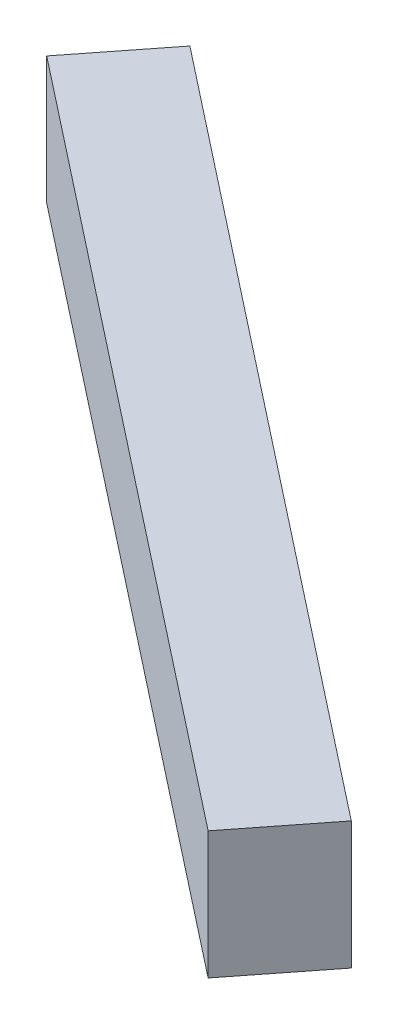
ISO-10303-21;
HEADER;
FILE_DESCRIPTION(('STEP AP214'),'2;1');
FILE_NAME('part.step','',(''),(''),'','','');
FILE_SCHEMA(('AUTOMOTIVE_DESIGN { 1 0 10303 214 1 1 1 1 }'));
ENDSEC;
DATA;
#1=APPLICATION_CONTEXT('core data for automotive mechanical design processes');
#2=APPLICATION_PROTOCOL_DEFINITION('international standard','automotive_design',2000,#1);
#3=PRODUCT_CONTEXT('',#1,'mechanical');
#4=PRODUCT('Part','Part','',(#3));
#5=PRODUCT_RELATED_PRODUCT_CATEGORY('part','',(#4));
#6=PRODUCT_DEFINITION_FORMATION('','',#4);
#7=PRODUCT_DEFINITION_CONTEXT('part definition',#1,'design');
#8=PRODUCT_DEFINITION('design','',#6,#7);
#9=PRODUCT_DEFINITION_SHAPE('','',#8);
#10=(LENGTH_UNIT() NAMED_UNIT(*) SI_UNIT(.MILLI.,.METRE.));
#11=(NAMED_UNIT(*) PLANE_ANGLE_UNIT() SI_UNIT($,.RADIAN.));
#12=(NAMED_UNIT(*) SI_UNIT($,.STERADIAN.) SOLID_ANGLE_UNIT());
#13=UNCERTAINTY_MEASURE_WITH_UNIT(LENGTH_MEASURE(1.E-05),#10,'distance_accuracy_value','');
#14=(GEOMETRIC_REPRESENTATION_CONTEXT(3) GLOBAL_UNCERTAINTY_ASSIGNED_CONTEXT((#13)) GLOBAL_UNIT_ASSIGNED_CONTEXT((#10,
#11,#12)) REPRESENTATION_CONTEXT('',''));
#15=CARTESIAN_POINT('',(0.,0.,0.));
#16=DIRECTION('',(0.,0.,1.));
#17=DIRECTION('',(1.,0.,0.));
#18=AXIS2_PLACEMENT_3D('',#15,#16,#17);
#19=CARTESIAN_POINT('',(-14.2159708698118,7.874,-11.0357727863713));
#20=DIRECTION('',(0.617612562807703,0.,-0.786482499654061));
#21=DIRECTION('',(-0.786482499654061,0.,-0.617612562807703));
#22=AXIS2_PLACEMENT_3D('',#19,#20,#21);
#23=PLANE('',#22);
#24=DIRECTION('',(0.,1.,0.));
#25=VECTOR('',#24,1.);
#26=CARTESIAN_POINT('',(-14.2159708698118,7.874,-11.0357727863713));
#27=LINE('',#26,#25);
#28=CARTESIAN_POINT('',(-14.2159708698118,7.62,-11.0357727863713));
#29=VERTEX_POINT('',#28);
#30=CARTESIAN_POINT('',(-14.2159708698118,7.874,-11.0357727863713));
#31=VERTEX_POINT('',#30);
#32=EDGE_CURVE('E20',#29,#31,#27,.T.);
#33=ORIENTED_EDGE('',*,*,#32,.T.);
#34=DIRECTION('',(-0.786482499654083,0.,-0.617612562807676));
#35=VECTOR('',#34,1.);
#36=CARTESIAN_POINT('',(-14.2159708698118,7.874,-11.0357727863713));
#37=LINE('',#36,#35);
#38=CARTESIAN_POINT('',(-15.7142200316528,7.874,-12.2123247185199));
#39=VERTEX_POINT('',#38);
#40=EDGE_CURVE('E55',#31,#39,#37,.T.);
#41=ORIENTED_EDGE('',*,*,#40,.T.);
#42=DIRECTION('',(0.,1.,0.));
#43=VECTOR('',#42,1.);
#44=CARTESIAN_POINT('',(-15.7142200316528,7.874,-12.2123247185199));
#45=LINE('',#44,#43);
#46=CARTESIAN_POINT('',(-15.7142200316528,7.62,-12.2123247185199));
#47=VERTEX_POINT('',#46);
#48=EDGE_CURVE('E76',#39,#47,#45,.F.);
#49=ORIENTED_EDGE('',*,*,#48,.T.);
#50=DIRECTION('',(-0.786482499654083,0.,-0.617612562807676));
#51=VECTOR('',#50,1.);
#52=CARTESIAN_POINT('',(-14.2159708698118,7.62,-11.0357727863713));
#53=LINE('',#52,#51);
#54=EDGE_CURVE('E58',#29,#47,#53,.T.);
#55=ORIENTED_EDGE('',*,*,#54,.F.);
#56=EDGE_LOOP('',(#33,#41,#49,#55));
#57=FACE_BOUND('',#56,.T.);
#58=ADVANCED_FACE('F17',(#57),#23,.F.);
#59=CARTESIAN_POINT('',(-14.2159708698118,7.874,-11.0357727863713));
#60=DIRECTION('',(-0.786482499654055,0.,-0.617612562807712));
#61=DIRECTION('',(-0.617612562807712,0.,0.786482499654055));
#62=AXIS2_PLACEMENT_3D('',#59,#60,#61);
#63=PLANE('',#62);
#64=DIRECTION('',(0.,1.,0.));
#65=VECTOR('',#64,1.);
#66=CARTESIAN_POINT('',(-14.0904719970492,7.874,-11.195586030301));
#67=LINE('',#66,#65);
#68=CARTESIAN_POINT('',(-14.0904719970492,7.62,-11.195586030301));
#69=VERTEX_POINT('',#68);
#70=CARTESIAN_POINT('',(-14.0904719970492,7.874,-11.195586030301));
#71=VERTEX_POINT('',#70);
#72=EDGE_CURVE('E73',#69,#71,#67,.T.);
#73=ORIENTED_EDGE('',*,*,#72,.T.);
#74=DIRECTION('',(-0.617612562807945,0.,0.786482499653872));
#75=VECTOR('',#74,1.);
#76=CARTESIAN_POINT('',(-14.0904719970492,7.874,-11.195586030301));
#77=LINE('',#76,#75);
#78=EDGE_CURVE('E63',#71,#31,#77,.T.);
#79=ORIENTED_EDGE('',*,*,#78,.T.);
#80=ORIENTED_EDGE('',*,*,#32,.F.);
#81=DIRECTION('',(-0.617612562807945,0.,0.786482499653872));
#82=VECTOR('',#81,1.);
#83=CARTESIAN_POINT('',(-14.0904719970492,7.62,-11.195586030301));
#84=LINE('',#83,#82);
#85=EDGE_CURVE('E80',#69,#29,#84,.T.);
#86=ORIENTED_EDGE('',*,*,#85,.F.);
#87=EDGE_LOOP('',(#73,#79,#80,#86));
#88=FACE_BOUND('',#87,.T.);
#89=ADVANCED_FACE('F72',(#88),#63,.F.);
#90=CARTESIAN_POINT('',(-14.2159708698118,7.874,-11.0357727863713));
#91=DIRECTION('',(0.,-1.,0.));
#92=DIRECTION('',(0.,0.,-1.));
#93=AXIS2_PLACEMENT_3D('',#90,#91,#92);
#94=PLANE('',#93);
#95=ORIENTED_EDGE('',*,*,#78,.F.);
#96=DIRECTION('',(0.786482499654278,0.,0.617612562807428));
#97=VECTOR('',#96,1.);
#98=CARTESIAN_POINT('',(-14.0904719970492,7.874,-11.195586030301));
#99=LINE('',#98,#97);
#100=CARTESIAN_POINT('',(-15.5887211591341,7.874,-12.3721379626403));
#101=VERTEX_POINT('',#100);
#102=EDGE_CURVE('E83',#71,#101,#99,.F.);
#103=ORIENTED_EDGE('',*,*,#102,.T.);
#104=DIRECTION('',(0.617612561609682,0.,-0.786482500594849));
#105=VECTOR('',#104,1.);
#106=CARTESIAN_POINT('',(-15.7142200316528,7.874,-12.2123247185199));
#107=LINE('',#106,#105);
#108=EDGE_CURVE('E69',#101,#39,#107,.F.);
#109=ORIENTED_EDGE('',*,*,#108,.T.);
#110=ORIENTED_EDGE('',*,*,#40,.F.);
#111=EDGE_LOOP('',(#95,#103,#109,#110));
#112=FACE_BOUND('',#111,.T.);
#113=ADVANCED_FACE('F66',(#112),#94,.F.);
#114=CARTESIAN_POINT('',(-15.7142200316528,7.874,-12.2123247185199));
#115=DIRECTION('',(0.786482500594849,0.,0.617612561609682));
#116=DIRECTION('',(0.617612561609682,0.,-0.786482500594849));
#117=AXIS2_PLACEMENT_3D('',#114,#115,#116);
#118=PLANE('',#117);
#119=ORIENTED_EDGE('',*,*,#48,.F.);
#120=ORIENTED_EDGE('',*,*,#108,.F.);
#121=DIRECTION('',(0.,1.,0.));
#122=VECTOR('',#121,1.);
#123=CARTESIAN_POINT('',(-15.5887211591341,7.874,-12.3721379626403));
#124=LINE('',#123,#122);
#125=CARTESIAN_POINT('',(-15.5887211591341,7.62,-12.3721379626403));
#126=VERTEX_POINT('',#125);
#127=EDGE_CURVE('E26',#101,#126,#124,.F.);
#128=ORIENTED_EDGE('',*,*,#127,.T.);
#129=DIRECTION('',(0.617612561609631,0.,-0.786482500594889));
#130=VECTOR('',#129,1.);
#131=CARTESIAN_POINT('',(-15.7142200316528,7.62,-12.2123247185199));
#132=LINE('',#131,#130);
#133=EDGE_CURVE('E34',#47,#126,#132,.T.);
#134=ORIENTED_EDGE('',*,*,#133,.F.);
#135=EDGE_LOOP('',(#119,#120,#128,#134));
#136=FACE_BOUND('',#135,.T.);
#137=ADVANCED_FACE('F88',(#136),#118,.F.);
#138=CARTESIAN_POINT('',(-14.2159708698118,7.62,-11.0357727863713));
#139=DIRECTION('',(0.,-1.,0.));
#140=DIRECTION('',(0.,0.,-1.));
#141=AXIS2_PLACEMENT_3D('',#138,#139,#140);
#142=PLANE('',#141);
#143=DIRECTION('',(0.786482499654278,0.,0.617612562807428));
#144=VECTOR('',#143,1.);
#145=CARTESIAN_POINT('',(-14.0904719970492,7.62,-11.195586030301));
#146=LINE('',#145,#144);
#147=EDGE_CURVE('E11',#126,#69,#146,.T.);
#148=ORIENTED_EDGE('',*,*,#147,.T.);
#149=ORIENTED_EDGE('',*,*,#85,.T.);
#150=ORIENTED_EDGE('',*,*,#54,.T.);
#151=ORIENTED_EDGE('',*,*,#133,.T.);
#152=EDGE_LOOP('',(#148,#149,#150,#151));
#153=FACE_BOUND('',#152,.T.);
#154=ADVANCED_FACE('F91',(#153),#142,.T.);
#155=CARTESIAN_POINT('',(-14.0904719970492,7.874,-11.195586030301));
#156=DIRECTION('',(-0.617612562807428,0.,0.786482499654278));
#157=DIRECTION('',(0.786482499654278,0.,0.617612562807428));
#158=AXIS2_PLACEMENT_3D('',#155,#156,#157);
#159=PLANE('',#158);
#160=ORIENTED_EDGE('',*,*,#127,.F.);
#161=ORIENTED_EDGE('',*,*,#102,.F.);
#162=ORIENTED_EDGE('',*,*,#72,.F.);
#163=ORIENTED_EDGE('',*,*,#147,.F.);
#164=EDGE_LOOP('',(#160,#161,#162,#163));
#165=FACE_BOUND('',#164,.T.);
#166=ADVANCED_FACE('F90',(#165),#159,.F.);
#167=CLOSED_SHELL('',(#58,#89,#113,#137,#154,#166));
#168=MANIFOLD_SOLID_BREP('B1',#167);
#169=ADVANCED_BREP_SHAPE_REPRESENTATION('',(#18,#168),#14);
#170=SHAPE_DEFINITION_REPRESENTATION(#9,#169);
ENDSEC;
END-ISO-10303-21;
